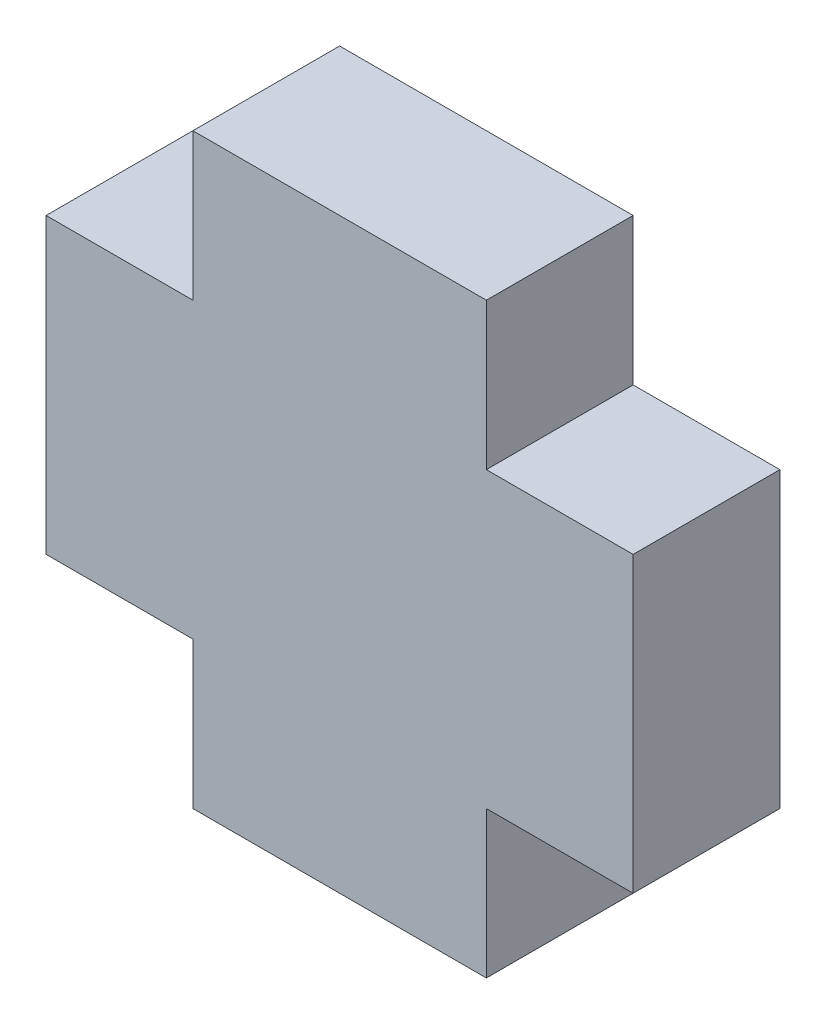
ISO-10303-21;
HEADER;
FILE_DESCRIPTION(('STEP AP214'),'2;1');
FILE_NAME('part.step','',(''),(''),'','','');
FILE_SCHEMA(('AUTOMOTIVE_DESIGN { 1 0 10303 214 1 1 1 1 }'));
ENDSEC;
DATA;
#1=APPLICATION_CONTEXT('core data for automotive mechanical design processes');
#2=APPLICATION_PROTOCOL_DEFINITION('international standard','automotive_design',2000,#1);
#3=PRODUCT_CONTEXT('',#1,'mechanical');
#4=PRODUCT('Part','Part','',(#3));
#5=PRODUCT_RELATED_PRODUCT_CATEGORY('part','',(#4));
#6=PRODUCT_DEFINITION_FORMATION('','',#4);
#7=PRODUCT_DEFINITION_CONTEXT('part definition',#1,'design');
#8=PRODUCT_DEFINITION('design','',#6,#7);
#9=PRODUCT_DEFINITION_SHAPE('','',#8);
#10=(LENGTH_UNIT() NAMED_UNIT(*) SI_UNIT(.MILLI.,.METRE.));
#11=(NAMED_UNIT(*) PLANE_ANGLE_UNIT() SI_UNIT($,.RADIAN.));
#12=(NAMED_UNIT(*) SI_UNIT($,.STERADIAN.) SOLID_ANGLE_UNIT());
#13=UNCERTAINTY_MEASURE_WITH_UNIT(LENGTH_MEASURE(1.E-05),#10,'distance_accuracy_value','');
#14=(GEOMETRIC_REPRESENTATION_CONTEXT(3) GLOBAL_UNCERTAINTY_ASSIGNED_CONTEXT((#13)) GLOBAL_UNIT_ASSIGNED_CONTEXT((#10,
#11,#12)) REPRESENTATION_CONTEXT('',''));
#15=CARTESIAN_POINT('',(0.,0.,0.));
#16=DIRECTION('',(0.,0.,1.));
#17=DIRECTION('',(1.,0.,0.));
#18=AXIS2_PLACEMENT_3D('',#15,#16,#17);
#19=CARTESIAN_POINT('',(-2.5,5.,2.5));
#20=DIRECTION('',(0.,-1.,0.));
#21=DIRECTION('',(0.,0.,-1.));
#22=AXIS2_PLACEMENT_3D('',#19,#20,#21);
#23=PLANE('',#22);
#24=DIRECTION('',(-1.,0.,0.));
#25=VECTOR('',#24,1.);
#26=CARTESIAN_POINT('',(-2.5,5.,0.));
#27=LINE('',#26,#25);
#28=CARTESIAN_POINT('',(2.5,5.,0.));
#29=VERTEX_POINT('',#28);
#30=CARTESIAN_POINT('',(-2.5,5.,0.));
#31=VERTEX_POINT('',#30);
#32=EDGE_CURVE('E153',#29,#31,#27,.T.);
#33=ORIENTED_EDGE('',*,*,#32,.T.);
#34=DIRECTION('',(0.,0.,-1.));
#35=VECTOR('',#34,1.);
#36=CARTESIAN_POINT('',(-2.5,5.,2.5));
#37=LINE('',#36,#35);
#38=CARTESIAN_POINT('',(-2.5,5.,2.5));
#39=VERTEX_POINT('',#38);
#40=EDGE_CURVE('E11',#39,#31,#37,.T.);
#41=ORIENTED_EDGE('',*,*,#40,.F.);
#42=DIRECTION('',(-1.,0.,0.));
#43=VECTOR('',#42,1.);
#44=CARTESIAN_POINT('',(-2.5,5.,2.5));
#45=LINE('',#44,#43);
#46=CARTESIAN_POINT('',(2.5,5.,2.5));
#47=VERTEX_POINT('',#46);
#48=EDGE_CURVE('E175',#47,#39,#45,.T.);
#49=ORIENTED_EDGE('',*,*,#48,.F.);
#50=DIRECTION('',(0.,0.,-1.));
#51=VECTOR('',#50,1.);
#52=CARTESIAN_POINT('',(2.5,5.,2.5));
#53=LINE('',#52,#51);
#54=EDGE_CURVE('E149',#47,#29,#53,.T.);
#55=ORIENTED_EDGE('',*,*,#54,.T.);
#56=EDGE_LOOP('',(#33,#41,#49,#55));
#57=FACE_BOUND('',#56,.T.);
#58=ADVANCED_FACE('F33',(#57),#23,.F.);
#59=CARTESIAN_POINT('',(-2.5,5.,2.5));
#60=DIRECTION('',(1.,0.,0.));
#61=DIRECTION('',(0.,1.,0.));
#62=AXIS2_PLACEMENT_3D('',#59,#60,#61);
#63=PLANE('',#62);
#64=DIRECTION('',(0.,-1.,0.));
#65=VECTOR('',#64,1.);
#66=CARTESIAN_POINT('',(-2.5,5.,0.));
#67=LINE('',#66,#65);
#68=CARTESIAN_POINT('',(-2.5,2.5,0.));
#69=VERTEX_POINT('',#68);
#70=EDGE_CURVE('E156',#31,#69,#67,.T.);
#71=ORIENTED_EDGE('',*,*,#70,.T.);
#72=DIRECTION('',(0.,0.,-1.));
#73=VECTOR('',#72,1.);
#74=CARTESIAN_POINT('',(-2.5,2.5,2.5));
#75=LINE('',#74,#73);
#76=CARTESIAN_POINT('',(-2.5,2.5,2.5));
#77=VERTEX_POINT('',#76);
#78=EDGE_CURVE('E41',#77,#69,#75,.T.);
#79=ORIENTED_EDGE('',*,*,#78,.F.);
#80=DIRECTION('',(0.,-1.,0.));
#81=VECTOR('',#80,1.);
#82=CARTESIAN_POINT('',(-2.5,5.,2.5));
#83=LINE('',#82,#81);
#84=EDGE_CURVE('E104',#39,#77,#83,.T.);
#85=ORIENTED_EDGE('',*,*,#84,.F.);
#86=ORIENTED_EDGE('',*,*,#40,.T.);
#87=EDGE_LOOP('',(#71,#79,#85,#86));
#88=FACE_BOUND('',#87,.T.);
#89=ADVANCED_FACE('F253',(#88),#63,.F.);
#90=CARTESIAN_POINT('',(-2.5,2.5,2.5));
#91=DIRECTION('',(0.,-1.,0.));
#92=DIRECTION('',(1.,0.,0.));
#93=AXIS2_PLACEMENT_3D('',#90,#91,#92);
#94=PLANE('',#93);
#95=DIRECTION('',(-1.,0.,0.));
#96=VECTOR('',#95,1.);
#97=CARTESIAN_POINT('',(-2.5,2.5,0.));
#98=LINE('',#97,#96);
#99=CARTESIAN_POINT('',(-5.,2.5,0.));
#100=VERTEX_POINT('',#99);
#101=EDGE_CURVE('E158',#69,#100,#98,.T.);
#102=ORIENTED_EDGE('',*,*,#101,.T.);
#103=DIRECTION('',(0.,0.,-1.));
#104=VECTOR('',#103,1.);
#105=CARTESIAN_POINT('',(-5.,2.5,2.5));
#106=LINE('',#105,#104);
#107=CARTESIAN_POINT('',(-5.,2.5,2.5));
#108=VERTEX_POINT('',#107);
#109=EDGE_CURVE('E194',#108,#100,#106,.T.);
#110=ORIENTED_EDGE('',*,*,#109,.F.);
#111=DIRECTION('',(-1.,0.,0.));
#112=VECTOR('',#111,1.);
#113=CARTESIAN_POINT('',(-2.5,2.5,2.5));
#114=LINE('',#113,#112);
#115=EDGE_CURVE('E202',#77,#108,#114,.T.);
#116=ORIENTED_EDGE('',*,*,#115,.F.);
#117=ORIENTED_EDGE('',*,*,#78,.T.);
#118=EDGE_LOOP('',(#102,#110,#116,#117));
#119=FACE_BOUND('',#118,.T.);
#120=ADVANCED_FACE('F200',(#119),#94,.F.);
#121=CARTESIAN_POINT('',(-5.,2.5,2.5));
#122=DIRECTION('',(1.,0.,0.));
#123=DIRECTION('',(0.,1.,0.));
#124=AXIS2_PLACEMENT_3D('',#121,#122,#123);
#125=PLANE('',#124);
#126=DIRECTION('',(0.,-1.,0.));
#127=VECTOR('',#126,1.);
#128=CARTESIAN_POINT('',(-5.,2.5,0.));
#129=LINE('',#128,#127);
#130=CARTESIAN_POINT('',(-5.,-2.5,0.));
#131=VERTEX_POINT('',#130);
#132=EDGE_CURVE('E160',#100,#131,#129,.T.);
#133=ORIENTED_EDGE('',*,*,#132,.T.);
#134=DIRECTION('',(0.,0.,-1.));
#135=VECTOR('',#134,1.);
#136=CARTESIAN_POINT('',(-5.,-2.5,2.5));
#137=LINE('',#136,#135);
#138=CARTESIAN_POINT('',(-5.,-2.5,2.5));
#139=VERTEX_POINT('',#138);
#140=EDGE_CURVE('E191',#139,#131,#137,.T.);
#141=ORIENTED_EDGE('',*,*,#140,.F.);
#142=DIRECTION('',(0.,-1.,0.));
#143=VECTOR('',#142,1.);
#144=CARTESIAN_POINT('',(-5.,2.5,2.5));
#145=LINE('',#144,#143);
#146=EDGE_CURVE('E220',#108,#139,#145,.T.);
#147=ORIENTED_EDGE('',*,*,#146,.F.);
#148=ORIENTED_EDGE('',*,*,#109,.T.);
#149=EDGE_LOOP('',(#133,#141,#147,#148));
#150=FACE_BOUND('',#149,.T.);
#151=ADVANCED_FACE('F211',(#150),#125,.F.);
#152=CARTESIAN_POINT('',(-2.5,-2.5,2.5));
#153=DIRECTION('',(0.,1.,0.));
#154=DIRECTION('',(-1.,0.,0.));
#155=AXIS2_PLACEMENT_3D('',#152,#153,#154);
#156=PLANE('',#155);
#157=DIRECTION('',(1.,0.,0.));
#158=VECTOR('',#157,1.);
#159=CARTESIAN_POINT('',(-2.5,-2.5,0.));
#160=LINE('',#159,#158);
#161=CARTESIAN_POINT('',(-2.5,-2.5,0.));
#162=VERTEX_POINT('',#161);
#163=EDGE_CURVE('E162',#131,#162,#160,.T.);
#164=ORIENTED_EDGE('',*,*,#163,.T.);
#165=DIRECTION('',(0.,0.,-1.));
#166=VECTOR('',#165,1.);
#167=CARTESIAN_POINT('',(-2.5,-2.5,2.5));
#168=LINE('',#167,#166);
#169=CARTESIAN_POINT('',(-2.5,-2.5,2.5));
#170=VERTEX_POINT('',#169);
#171=EDGE_CURVE('E188',#170,#162,#168,.T.);
#172=ORIENTED_EDGE('',*,*,#171,.F.);
#173=DIRECTION('',(1.,0.,0.));
#174=VECTOR('',#173,1.);
#175=CARTESIAN_POINT('',(-2.5,-2.5,2.5));
#176=LINE('',#175,#174);
#177=EDGE_CURVE('E217',#139,#170,#176,.T.);
#178=ORIENTED_EDGE('',*,*,#177,.F.);
#179=ORIENTED_EDGE('',*,*,#140,.T.);
#180=EDGE_LOOP('',(#164,#172,#178,#179));
#181=FACE_BOUND('',#180,.T.);
#182=ADVANCED_FACE('F215',(#181),#156,.F.);
#183=CARTESIAN_POINT('',(-2.5,-5.,2.5));
#184=DIRECTION('',(1.,0.,0.));
#185=DIRECTION('',(0.,1.,0.));
#186=AXIS2_PLACEMENT_3D('',#183,#184,#185);
#187=PLANE('',#186);
#188=DIRECTION('',(0.,-1.,0.));
#189=VECTOR('',#188,1.);
#190=CARTESIAN_POINT('',(-2.5,-5.,0.));
#191=LINE('',#190,#189);
#192=CARTESIAN_POINT('',(-2.5,-5.,0.));
#193=VERTEX_POINT('',#192);
#194=EDGE_CURVE('E164',#162,#193,#191,.T.);
#195=ORIENTED_EDGE('',*,*,#194,.T.);
#196=DIRECTION('',(0.,0.,-1.));
#197=VECTOR('',#196,1.);
#198=CARTESIAN_POINT('',(-2.5,-5.,2.5));
#199=LINE('',#198,#197);
#200=CARTESIAN_POINT('',(-2.5,-5.,2.5));
#201=VERTEX_POINT('',#200);
#202=EDGE_CURVE('E185',#201,#193,#199,.T.);
#203=ORIENTED_EDGE('',*,*,#202,.F.);
#204=DIRECTION('',(0.,-1.,0.));
#205=VECTOR('',#204,1.);
#206=CARTESIAN_POINT('',(-2.5,-5.,2.5));
#207=LINE('',#206,#205);
#208=EDGE_CURVE('E219',#170,#201,#207,.T.);
#209=ORIENTED_EDGE('',*,*,#208,.F.);
#210=ORIENTED_EDGE('',*,*,#171,.T.);
#211=EDGE_LOOP('',(#195,#203,#209,#210));
#212=FACE_BOUND('',#211,.T.);
#213=ADVANCED_FACE('F266',(#212),#187,.F.);
#214=CARTESIAN_POINT('',(-2.5,-5.,2.5));
#215=DIRECTION('',(0.,1.,0.));
#216=DIRECTION('',(0.,0.,1.));
#217=AXIS2_PLACEMENT_3D('',#214,#215,#216);
#218=PLANE('',#217);
#219=DIRECTION('',(1.,0.,0.));
#220=VECTOR('',#219,1.);
#221=CARTESIAN_POINT('',(-2.5,-5.,0.));
#222=LINE('',#221,#220);
#223=CARTESIAN_POINT('',(2.5,-5.,0.));
#224=VERTEX_POINT('',#223);
#225=EDGE_CURVE('E166',#193,#224,#222,.T.);
#226=ORIENTED_EDGE('',*,*,#225,.T.);
#227=DIRECTION('',(0.,0.,-1.));
#228=VECTOR('',#227,1.);
#229=CARTESIAN_POINT('',(2.5,-5.,2.5));
#230=LINE('',#229,#228);
#231=CARTESIAN_POINT('',(2.5,-5.,2.5));
#232=VERTEX_POINT('',#231);
#233=EDGE_CURVE('E182',#232,#224,#230,.T.);
#234=ORIENTED_EDGE('',*,*,#233,.F.);
#235=DIRECTION('',(1.,0.,0.));
#236=VECTOR('',#235,1.);
#237=CARTESIAN_POINT('',(-2.5,-5.,2.5));
#238=LINE('',#237,#236);
#239=EDGE_CURVE('E222',#201,#232,#238,.T.);
#240=ORIENTED_EDGE('',*,*,#239,.F.);
#241=ORIENTED_EDGE('',*,*,#202,.T.);
#242=EDGE_LOOP('',(#226,#234,#240,#241));
#243=FACE_BOUND('',#242,.T.);
#244=ADVANCED_FACE('F269',(#243),#218,.F.);
#245=CARTESIAN_POINT('',(2.5,-5.,2.5));
#246=DIRECTION('',(-1.,0.,0.));
#247=DIRECTION('',(0.,-1.,0.));
#248=AXIS2_PLACEMENT_3D('',#245,#246,#247);
#249=PLANE('',#248);
#250=DIRECTION('',(0.,1.,0.));
#251=VECTOR('',#250,1.);
#252=CARTESIAN_POINT('',(2.5,-5.,0.));
#253=LINE('',#252,#251);
#254=CARTESIAN_POINT('',(2.5,-2.5,0.));
#255=VERTEX_POINT('',#254);
#256=EDGE_CURVE('E168',#224,#255,#253,.T.);
#257=ORIENTED_EDGE('',*,*,#256,.T.);
#258=DIRECTION('',(0.,0.,-1.));
#259=VECTOR('',#258,1.);
#260=CARTESIAN_POINT('',(2.5,-2.5,2.5));
#261=LINE('',#260,#259);
#262=CARTESIAN_POINT('',(2.5,-2.5,2.5));
#263=VERTEX_POINT('',#262);
#264=EDGE_CURVE('E179',#263,#255,#261,.T.);
#265=ORIENTED_EDGE('',*,*,#264,.F.);
#266=DIRECTION('',(0.,1.,0.));
#267=VECTOR('',#266,1.);
#268=CARTESIAN_POINT('',(2.5,-5.,2.5));
#269=LINE('',#268,#267);
#270=EDGE_CURVE('E228',#232,#263,#269,.T.);
#271=ORIENTED_EDGE('',*,*,#270,.F.);
#272=ORIENTED_EDGE('',*,*,#233,.T.);
#273=EDGE_LOOP('',(#257,#265,#271,#272));
#274=FACE_BOUND('',#273,.T.);
#275=ADVANCED_FACE('F234',(#274),#249,.F.);
#276=CARTESIAN_POINT('',(2.5,-2.5,2.5));
#277=DIRECTION('',(0.,1.,0.));
#278=DIRECTION('',(-1.,0.,0.));
#279=AXIS2_PLACEMENT_3D('',#276,#277,#278);
#280=PLANE('',#279);
#281=DIRECTION('',(1.,0.,0.));
#282=VECTOR('',#281,1.);
#283=CARTESIAN_POINT('',(2.5,-2.5,0.));
#284=LINE('',#283,#282);
#285=CARTESIAN_POINT('',(5.,-2.5,0.));
#286=VERTEX_POINT('',#285);
#287=EDGE_CURVE('E170',#255,#286,#284,.T.);
#288=ORIENTED_EDGE('',*,*,#287,.T.);
#289=DIRECTION('',(0.,0.,-1.));
#290=VECTOR('',#289,1.);
#291=CARTESIAN_POINT('',(5.,-2.5,2.5));
#292=LINE('',#291,#290);
#293=CARTESIAN_POINT('',(5.,-2.5,2.5));
#294=VERTEX_POINT('',#293);
#295=EDGE_CURVE('E144',#294,#286,#292,.T.);
#296=ORIENTED_EDGE('',*,*,#295,.F.);
#297=DIRECTION('',(1.,0.,0.));
#298=VECTOR('',#297,1.);
#299=CARTESIAN_POINT('',(2.5,-2.5,2.5));
#300=LINE('',#299,#298);
#301=EDGE_CURVE('E135',#263,#294,#300,.T.);
#302=ORIENTED_EDGE('',*,*,#301,.F.);
#303=ORIENTED_EDGE('',*,*,#264,.T.);
#304=EDGE_LOOP('',(#288,#296,#302,#303));
#305=FACE_BOUND('',#304,.T.);
#306=ADVANCED_FACE('F238',(#305),#280,.F.);
#307=CARTESIAN_POINT('',(5.,2.5,2.5));
#308=DIRECTION('',(-1.,0.,0.));
#309=DIRECTION('',(0.,-1.,0.));
#310=AXIS2_PLACEMENT_3D('',#307,#308,#309);
#311=PLANE('',#310);
#312=DIRECTION('',(0.,1.,0.));
#313=VECTOR('',#312,1.);
#314=CARTESIAN_POINT('',(5.,2.5,0.));
#315=LINE('',#314,#313);
#316=CARTESIAN_POINT('',(5.,2.5,0.));
#317=VERTEX_POINT('',#316);
#318=EDGE_CURVE('E143',#286,#317,#315,.T.);
#319=ORIENTED_EDGE('',*,*,#318,.T.);
#320=DIRECTION('',(0.,0.,-1.));
#321=VECTOR('',#320,1.);
#322=CARTESIAN_POINT('',(5.,2.5,2.5));
#323=LINE('',#322,#321);
#324=CARTESIAN_POINT('',(5.,2.5,2.5));
#325=VERTEX_POINT('',#324);
#326=EDGE_CURVE('E140',#325,#317,#323,.T.);
#327=ORIENTED_EDGE('',*,*,#326,.F.);
#328=DIRECTION('',(0.,1.,0.));
#329=VECTOR('',#328,1.);
#330=CARTESIAN_POINT('',(5.,2.5,2.5));
#331=LINE('',#330,#329);
#332=EDGE_CURVE('E129',#294,#325,#331,.T.);
#333=ORIENTED_EDGE('',*,*,#332,.F.);
#334=ORIENTED_EDGE('',*,*,#295,.T.);
#335=EDGE_LOOP('',(#319,#327,#333,#334));
#336=FACE_BOUND('',#335,.T.);
#337=ADVANCED_FACE('F141',(#336),#311,.F.);
#338=CARTESIAN_POINT('',(2.5,2.5,2.5));
#339=DIRECTION('',(0.,-1.,0.));
#340=DIRECTION('',(1.,0.,0.));
#341=AXIS2_PLACEMENT_3D('',#338,#339,#340);
#342=PLANE('',#341);
#343=DIRECTION('',(-1.,0.,0.));
#344=VECTOR('',#343,1.);
#345=CARTESIAN_POINT('',(2.5,2.5,0.));
#346=LINE('',#345,#344);
#347=CARTESIAN_POINT('',(2.5,2.5,0.));
#348=VERTEX_POINT('',#347);
#349=EDGE_CURVE('E90',#317,#348,#346,.T.);
#350=ORIENTED_EDGE('',*,*,#349,.T.);
#351=DIRECTION('',(0.,0.,-1.));
#352=VECTOR('',#351,1.);
#353=CARTESIAN_POINT('',(2.5,2.5,2.5));
#354=LINE('',#353,#352);
#355=CARTESIAN_POINT('',(2.5,2.5,2.5));
#356=VERTEX_POINT('',#355);
#357=EDGE_CURVE('E145',#356,#348,#354,.T.);
#358=ORIENTED_EDGE('',*,*,#357,.F.);
#359=DIRECTION('',(-1.,0.,0.));
#360=VECTOR('',#359,1.);
#361=CARTESIAN_POINT('',(2.5,2.5,2.5));
#362=LINE('',#361,#360);
#363=EDGE_CURVE('E133',#325,#356,#362,.T.);
#364=ORIENTED_EDGE('',*,*,#363,.F.);
#365=ORIENTED_EDGE('',*,*,#326,.T.);
#366=EDGE_LOOP('',(#350,#358,#364,#365));
#367=FACE_BOUND('',#366,.T.);
#368=ADVANCED_FACE('F147',(#367),#342,.F.);
#369=CARTESIAN_POINT('',(2.5,5.,2.5));
#370=DIRECTION('',(-1.,0.,0.));
#371=DIRECTION('',(0.,-1.,0.));
#372=AXIS2_PLACEMENT_3D('',#369,#370,#371);
#373=PLANE('',#372);
#374=DIRECTION('',(0.,1.,0.));
#375=VECTOR('',#374,1.);
#376=CARTESIAN_POINT('',(2.5,5.,0.));
#377=LINE('',#376,#375);
#378=EDGE_CURVE('E96',#348,#29,#377,.T.);
#379=ORIENTED_EDGE('',*,*,#378,.T.);
#380=ORIENTED_EDGE('',*,*,#54,.F.);
#381=DIRECTION('',(0.,1.,0.));
#382=VECTOR('',#381,1.);
#383=CARTESIAN_POINT('',(2.5,5.,2.5));
#384=LINE('',#383,#382);
#385=EDGE_CURVE('E49',#356,#47,#384,.T.);
#386=ORIENTED_EDGE('',*,*,#385,.F.);
#387=ORIENTED_EDGE('',*,*,#357,.T.);
#388=EDGE_LOOP('',(#379,#380,#386,#387));
#389=FACE_BOUND('',#388,.T.);
#390=ADVANCED_FACE('F242',(#389),#373,.F.);
#391=CARTESIAN_POINT('',(0.,0.,2.5));
#392=DIRECTION('',(0.,0.,-1.));
#393=DIRECTION('',(-1.,0.,0.));
#394=AXIS2_PLACEMENT_3D('',#391,#392,#393);
#395=PLANE('',#394);
#396=ORIENTED_EDGE('',*,*,#48,.T.);
#397=ORIENTED_EDGE('',*,*,#84,.T.);
#398=ORIENTED_EDGE('',*,*,#115,.T.);
#399=ORIENTED_EDGE('',*,*,#146,.T.);
#400=ORIENTED_EDGE('',*,*,#177,.T.);
#401=ORIENTED_EDGE('',*,*,#208,.T.);
#402=ORIENTED_EDGE('',*,*,#239,.T.);
#403=ORIENTED_EDGE('',*,*,#270,.T.);
#404=ORIENTED_EDGE('',*,*,#301,.T.);
#405=ORIENTED_EDGE('',*,*,#332,.T.);
#406=ORIENTED_EDGE('',*,*,#363,.T.);
#407=ORIENTED_EDGE('',*,*,#385,.T.);
#408=EDGE_LOOP('',(#396,#397,#398,#399,#400,#401,#402,#403,#404,#405,#406,#407));
#409=FACE_BOUND('',#408,.T.);
#410=ADVANCED_FACE('F131',(#409),#395,.F.);
#411=CARTESIAN_POINT('',(0.,0.,0.));
#412=DIRECTION('',(0.,0.,-1.));
#413=DIRECTION('',(-1.,0.,0.));
#414=AXIS2_PLACEMENT_3D('',#411,#412,#413);
#415=PLANE('',#414);
#416=ORIENTED_EDGE('',*,*,#32,.F.);
#417=ORIENTED_EDGE('',*,*,#378,.F.);
#418=ORIENTED_EDGE('',*,*,#349,.F.);
#419=ORIENTED_EDGE('',*,*,#318,.F.);
#420=ORIENTED_EDGE('',*,*,#287,.F.);
#421=ORIENTED_EDGE('',*,*,#256,.F.);
#422=ORIENTED_EDGE('',*,*,#225,.F.);
#423=ORIENTED_EDGE('',*,*,#194,.F.);
#424=ORIENTED_EDGE('',*,*,#163,.F.);
#425=ORIENTED_EDGE('',*,*,#132,.F.);
#426=ORIENTED_EDGE('',*,*,#101,.F.);
#427=ORIENTED_EDGE('',*,*,#70,.F.);
#428=EDGE_LOOP('',(#416,#417,#418,#419,#420,#421,#422,#423,#424,#425,#426,#427));
#429=FACE_BOUND('',#428,.T.);
#430=ADVANCED_FACE('F206',(#429),#415,.T.);
#431=CLOSED_SHELL('',(#58,#89,#120,#151,#182,#213,#244,#275,#306,#337,#368,#390,#410,#430));
#432=MANIFOLD_SOLID_BREP('B2',#431);
#433=ADVANCED_BREP_SHAPE_REPRESENTATION('',(#18,#432),#14);
#434=SHAPE_DEFINITION_REPRESENTATION(#9,#433);
ENDSEC;
END-ISO-10303-21;
